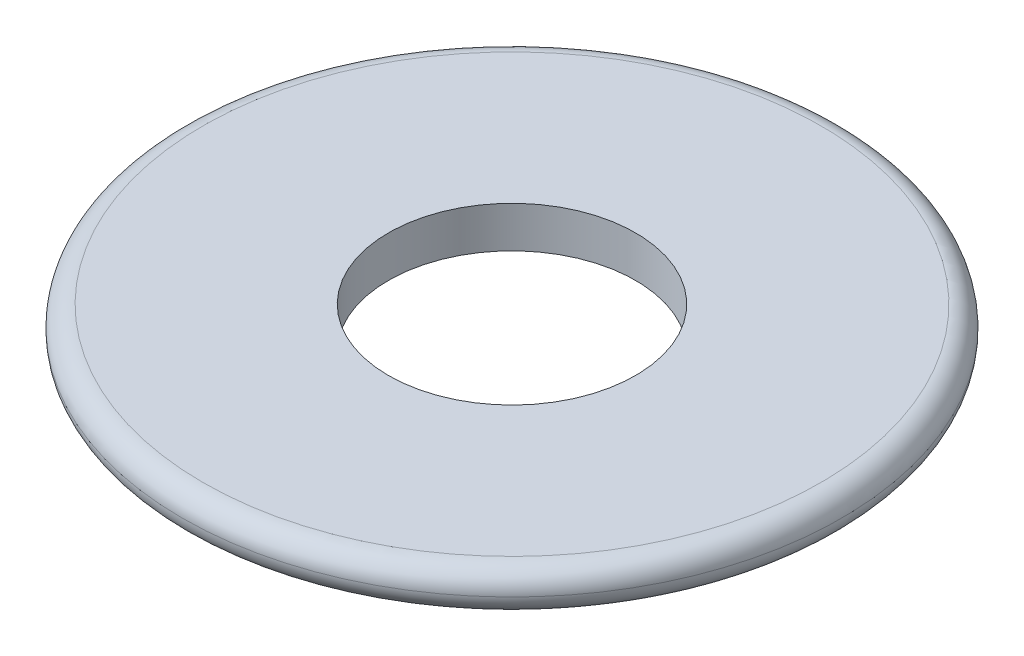
ISO-10303-21;
HEADER;
FILE_DESCRIPTION(('STEP AP214'),'2;1');
FILE_NAME('part.step','',(''),(''),'','','');
FILE_SCHEMA(('AUTOMOTIVE_DESIGN { 1 0 10303 214 1 1 1 1 }'));
ENDSEC;
DATA;
#1=APPLICATION_CONTEXT('core data for automotive mechanical design processes');
#2=APPLICATION_PROTOCOL_DEFINITION('international standard','automotive_design',2000,#1);
#3=PRODUCT_CONTEXT('',#1,'mechanical');
#4=PRODUCT('Part','Part','',(#3));
#5=PRODUCT_RELATED_PRODUCT_CATEGORY('part','',(#4));
#6=PRODUCT_DEFINITION_FORMATION('','',#4);
#7=PRODUCT_DEFINITION_CONTEXT('part definition',#1,'design');
#8=PRODUCT_DEFINITION('design','',#6,#7);
#9=PRODUCT_DEFINITION_SHAPE('','',#8);
#10=(LENGTH_UNIT() NAMED_UNIT(*) SI_UNIT(.MILLI.,.METRE.));
#11=(NAMED_UNIT(*) PLANE_ANGLE_UNIT() SI_UNIT($,.RADIAN.));
#12=(NAMED_UNIT(*) SI_UNIT($,.STERADIAN.) SOLID_ANGLE_UNIT());
#13=UNCERTAINTY_MEASURE_WITH_UNIT(LENGTH_MEASURE(1.E-05),#10,'distance_accuracy_value','');
#14=(GEOMETRIC_REPRESENTATION_CONTEXT(3) GLOBAL_UNCERTAINTY_ASSIGNED_CONTEXT((#13)) GLOBAL_UNIT_ASSIGNED_CONTEXT((#10,
#11,#12)) REPRESENTATION_CONTEXT('',''));
#15=CARTESIAN_POINT('',(0.,0.,0.));
#16=DIRECTION('',(0.,0.,1.));
#17=DIRECTION('',(1.,0.,0.));
#18=AXIS2_PLACEMENT_3D('',#15,#16,#17);
#19=CARTESIAN_POINT('',(0.,0.5,0.));
#20=DIRECTION('',(0.,1.,0.));
#21=DIRECTION('',(0.,0.,1.));
#22=AXIS2_PLACEMENT_3D('',#19,#20,#21);
#23=PLANE('',#22);
#24=CARTESIAN_POINT('',(0.,0.5,0.));
#25=DIRECTION('',(0.,1.,0.));
#26=DIRECTION('',(0.,0.,1.));
#27=AXIS2_PLACEMENT_3D('',#24,#25,#26);
#28=CIRCLE('',#27,7.5);
#29=CARTESIAN_POINT('',(0.,0.5,7.5));
#30=VERTEX_POINT('',#29);
#31=EDGE_CURVE('E10',#30,#30,#28,.T.);
#32=ORIENTED_EDGE('',*,*,#31,.T.);
#33=EDGE_LOOP('',(#32));
#34=FACE_BOUND('',#33,.T.);
#35=CARTESIAN_POINT('',(0.,0.5,0.));
#36=DIRECTION('',(0.,1.,0.));
#37=DIRECTION('',(0.,0.,1.));
#38=AXIS2_PLACEMENT_3D('',#35,#36,#37);
#39=CIRCLE('',#38,3.);
#40=CARTESIAN_POINT('',(0.,0.5,3.));
#41=VERTEX_POINT('',#40);
#42=EDGE_CURVE('E44',#41,#41,#39,.T.);
#43=ORIENTED_EDGE('',*,*,#42,.F.);
#44=EDGE_LOOP('',(#43));
#45=FACE_BOUND('',#44,.T.);
#46=ADVANCED_FACE('F32',(#34,#45),#23,.T.);
#47=CARTESIAN_POINT('',(0.,-0.5,0.));
#48=DIRECTION('',(0.,1.,0.));
#49=DIRECTION('',(0.,0.,1.));
#50=AXIS2_PLACEMENT_3D('',#47,#48,#49);
#51=PLANE('',#50);
#52=CARTESIAN_POINT('',(0.,-0.5,0.));
#53=DIRECTION('',(0.,1.,0.));
#54=DIRECTION('',(0.,0.,1.));
#55=AXIS2_PLACEMENT_3D('',#52,#53,#54);
#56=CIRCLE('',#55,7.5);
#57=CARTESIAN_POINT('',(0.,-0.5,7.5));
#58=VERTEX_POINT('',#57);
#59=EDGE_CURVE('E40',#58,#58,#56,.F.);
#60=ORIENTED_EDGE('',*,*,#59,.T.);
#61=EDGE_LOOP('',(#60));
#62=FACE_BOUND('',#61,.T.);
#63=CARTESIAN_POINT('',(0.,-0.5,0.));
#64=DIRECTION('',(0.,1.,0.));
#65=DIRECTION('',(0.,0.,1.));
#66=AXIS2_PLACEMENT_3D('',#63,#64,#65);
#67=CIRCLE('',#66,3.);
#68=CARTESIAN_POINT('',(0.,-0.5,3.));
#69=VERTEX_POINT('',#68);
#70=EDGE_CURVE('E47',#69,#69,#67,.T.);
#71=ORIENTED_EDGE('',*,*,#70,.T.);
#72=EDGE_LOOP('',(#71));
#73=FACE_BOUND('',#72,.T.);
#74=ADVANCED_FACE('F57',(#62,#73),#51,.F.);
#75=CARTESIAN_POINT('',(0.,0.5,0.));
#76=DIRECTION('',(0.,-1.,0.));
#77=DIRECTION('',(0.,0.,-1.));
#78=AXIS2_PLACEMENT_3D('',#75,#76,#77);
#79=CYLINDRICAL_SURFACE('',#78,3.);
#80=ORIENTED_EDGE('',*,*,#42,.T.);
#81=EDGE_LOOP('',(#80));
#82=FACE_BOUND('',#81,.T.);
#83=ORIENTED_EDGE('',*,*,#70,.F.);
#84=EDGE_LOOP('',(#83));
#85=FACE_BOUND('',#84,.T.);
#86=ADVANCED_FACE('F53',(#82,#85),#79,.F.);
#87=CARTESIAN_POINT('',(0.,0.,0.));
#88=DIRECTION('',(0.,1.,0.));
#89=DIRECTION('',(0.,0.,1.));
#90=AXIS2_PLACEMENT_3D('',#87,#88,#89);
#91=TOROIDAL_SURFACE('',#90,7.5,0.5);
#92=ORIENTED_EDGE('',*,*,#31,.F.);
#93=EDGE_LOOP('',(#92));
#94=FACE_BOUND('',#93,.T.);
#95=CARTESIAN_POINT('',(0.,0.,0.));
#96=DIRECTION('',(0.,1.,0.));
#97=DIRECTION('',(0.,0.,1.));
#98=AXIS2_PLACEMENT_3D('',#95,#96,#97);
#99=CIRCLE('',#98,8.);
#100=CARTESIAN_POINT('',(0.,0.,8.));
#101=VERTEX_POINT('',#100);
#102=EDGE_CURVE('E36',#101,#101,#99,.F.);
#103=ORIENTED_EDGE('',*,*,#102,.F.);
#104=EDGE_LOOP('',(#103));
#105=FACE_BOUND('',#104,.T.);
#106=ADVANCED_FACE('F34',(#94,#105),#91,.T.);
#107=CARTESIAN_POINT('',(0.,0.,0.));
#108=DIRECTION('',(0.,1.,0.));
#109=DIRECTION('',(0.,0.,1.));
#110=AXIS2_PLACEMENT_3D('',#107,#108,#109);
#111=TOROIDAL_SURFACE('',#110,7.5,0.5);
#112=ORIENTED_EDGE('',*,*,#59,.F.);
#113=EDGE_LOOP('',(#112));
#114=FACE_BOUND('',#113,.T.);
#115=ORIENTED_EDGE('',*,*,#102,.T.);
#116=EDGE_LOOP('',(#115));
#117=FACE_BOUND('',#116,.T.);
#118=ADVANCED_FACE('F65',(#114,#117),#111,.T.);
#119=CLOSED_SHELL('',(#46,#74,#86,#106,#118));
#120=MANIFOLD_SOLID_BREP('B2',#119);
#121=ADVANCED_BREP_SHAPE_REPRESENTATION('',(#18,#120),#14);
#122=SHAPE_DEFINITION_REPRESENTATION(#9,#121);
ENDSEC;
END-ISO-10303-21;
